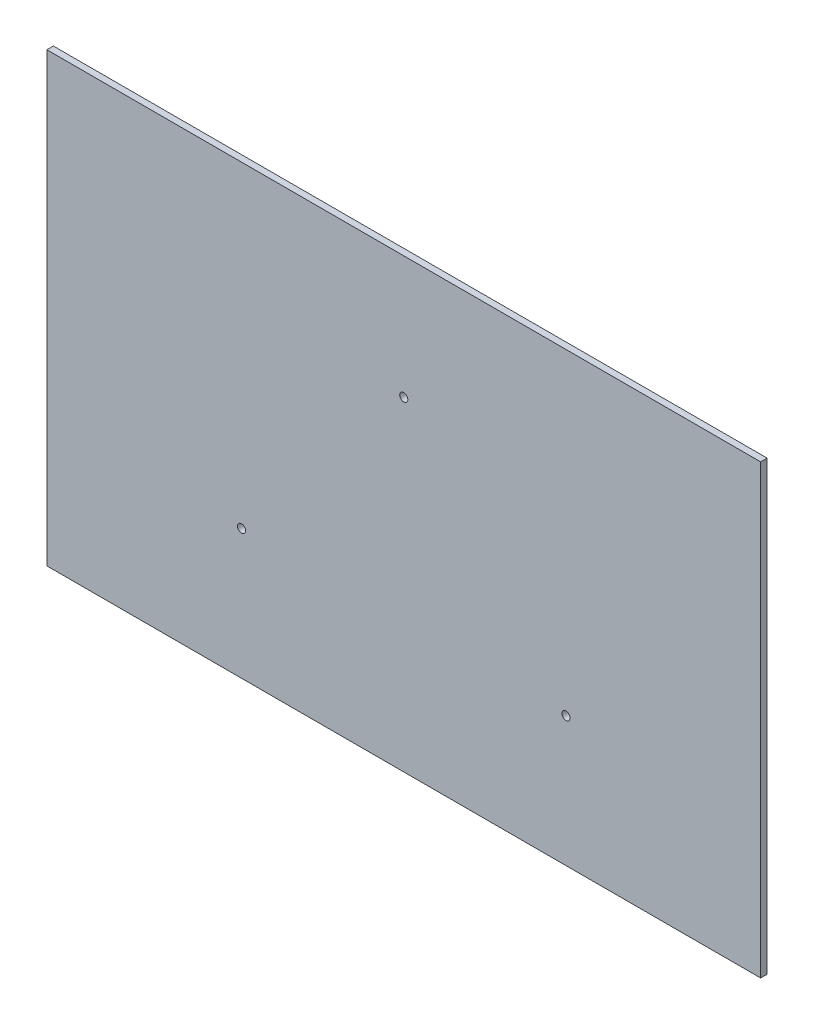
ISO-10303-21;
HEADER;
FILE_DESCRIPTION(('STEP AP214'),'2;1');
FILE_NAME('part.step','',(''),(''),'','','');
FILE_SCHEMA(('AUTOMOTIVE_DESIGN { 1 0 10303 214 1 1 1 1 }'));
ENDSEC;
DATA;
#1=APPLICATION_CONTEXT('core data for automotive mechanical design processes');
#2=APPLICATION_PROTOCOL_DEFINITION('international standard','automotive_design',2000,#1);
#3=PRODUCT_CONTEXT('',#1,'mechanical');
#4=PRODUCT('Part','Part','',(#3));
#5=PRODUCT_RELATED_PRODUCT_CATEGORY('part','',(#4));
#6=PRODUCT_DEFINITION_FORMATION('','',#4);
#7=PRODUCT_DEFINITION_CONTEXT('part definition',#1,'design');
#8=PRODUCT_DEFINITION('design','',#6,#7);
#9=PRODUCT_DEFINITION_SHAPE('','',#8);
#10=(LENGTH_UNIT() NAMED_UNIT(*) SI_UNIT(.MILLI.,.METRE.));
#11=(NAMED_UNIT(*) PLANE_ANGLE_UNIT() SI_UNIT($,.RADIAN.));
#12=(NAMED_UNIT(*) SI_UNIT($,.STERADIAN.) SOLID_ANGLE_UNIT());
#13=UNCERTAINTY_MEASURE_WITH_UNIT(LENGTH_MEASURE(1.E-05),#10,'distance_accuracy_value','');
#14=(GEOMETRIC_REPRESENTATION_CONTEXT(3) GLOBAL_UNCERTAINTY_ASSIGNED_CONTEXT((#13)) GLOBAL_UNIT_ASSIGNED_CONTEXT((#10,
#11,#12)) REPRESENTATION_CONTEXT('',''));
#15=CARTESIAN_POINT('',(0.,0.,0.));
#16=DIRECTION('',(0.,0.,1.));
#17=DIRECTION('',(1.,0.,0.));
#18=AXIS2_PLACEMENT_3D('',#15,#16,#17);
#19=CARTESIAN_POINT('',(0.,0.,2.54));
#20=DIRECTION('',(0.,0.,1.));
#21=DIRECTION('',(1.,0.,0.));
#22=AXIS2_PLACEMENT_3D('',#19,#20,#21);
#23=PLANE('',#22);
#24=CARTESIAN_POINT('',(63.5,-36.6888888888889,2.54));
#25=DIRECTION('',(0.,0.,1.));
#26=DIRECTION('',(1.,0.,0.));
#27=AXIS2_PLACEMENT_3D('',#24,#25,#26);
#28=CIRCLE('',#27,1.58749999999999);
#29=CARTESIAN_POINT('',(65.0875,-36.6888888888889,2.54));
#30=VERTEX_POINT('',#29);
#31=EDGE_CURVE('E118',#30,#30,#28,.T.);
#32=ORIENTED_EDGE('',*,*,#31,.F.);
#33=EDGE_LOOP('',(#32));
#34=FACE_BOUND('',#33,.T.);
#35=DIRECTION('',(0.,-1.,0.));
#36=VECTOR('',#35,1.);
#37=CARTESIAN_POINT('',(-139.7,-87.4888888888889,2.54));
#38=LINE('',#37,#36);
#39=CARTESIAN_POINT('',(-139.7,87.4888888888889,2.54));
#40=VERTEX_POINT('',#39);
#41=CARTESIAN_POINT('',(-139.7,-87.4888888888889,2.54));
#42=VERTEX_POINT('',#41);
#43=EDGE_CURVE('E88',#40,#42,#38,.T.);
#44=ORIENTED_EDGE('',*,*,#43,.T.);
#45=DIRECTION('',(1.,0.,0.));
#46=VECTOR('',#45,1.);
#47=CARTESIAN_POINT('',(139.7,-87.4888888888889,2.54));
#48=LINE('',#47,#46);
#49=CARTESIAN_POINT('',(139.7,-87.4888888888889,2.54));
#50=VERTEX_POINT('',#49);
#51=EDGE_CURVE('E83',#42,#50,#48,.T.);
#52=ORIENTED_EDGE('',*,*,#51,.T.);
#53=DIRECTION('',(0.,1.,0.));
#54=VECTOR('',#53,1.);
#55=CARTESIAN_POINT('',(139.7,-87.4888888888889,2.54));
#56=LINE('',#55,#54);
#57=CARTESIAN_POINT('',(139.7,87.4888888888889,2.54));
#58=VERTEX_POINT('',#57);
#59=EDGE_CURVE('E86',#50,#58,#56,.T.);
#60=ORIENTED_EDGE('',*,*,#59,.T.);
#61=DIRECTION('',(-1.,0.,0.));
#62=VECTOR('',#61,1.);
#63=CARTESIAN_POINT('',(139.7,87.4888888888889,2.54));
#64=LINE('',#63,#62);
#65=EDGE_CURVE('E53',#58,#40,#64,.T.);
#66=ORIENTED_EDGE('',*,*,#65,.T.);
#67=EDGE_LOOP('',(#44,#52,#60,#66));
#68=FACE_BOUND('',#67,.T.);
#69=CARTESIAN_POINT('',(-63.5,-36.6888888888889,2.54));
#70=DIRECTION('',(0.,0.,1.));
#71=DIRECTION('',(1.,0.,0.));
#72=AXIS2_PLACEMENT_3D('',#69,#70,#71);
#73=CIRCLE('',#72,1.58749999999999);
#74=CARTESIAN_POINT('',(-61.9125,-36.6888888888889,2.54));
#75=VERTEX_POINT('',#74);
#76=EDGE_CURVE('E103',#75,#75,#73,.T.);
#77=ORIENTED_EDGE('',*,*,#76,.F.);
#78=EDGE_LOOP('',(#77));
#79=FACE_BOUND('',#78,.T.);
#80=CARTESIAN_POINT('',(0.,39.5111111111111,2.54));
#81=DIRECTION('',(0.,0.,1.));
#82=DIRECTION('',(1.,0.,0.));
#83=AXIS2_PLACEMENT_3D('',#80,#81,#82);
#84=CIRCLE('',#83,1.5875);
#85=CARTESIAN_POINT('',(1.5875,39.5111111111111,2.54));
#86=VERTEX_POINT('',#85);
#87=EDGE_CURVE('E124',#86,#86,#84,.T.);
#88=ORIENTED_EDGE('',*,*,#87,.F.);
#89=EDGE_LOOP('',(#88));
#90=FACE_BOUND('',#89,.T.);
#91=ADVANCED_FACE('F36',(#34,#68,#79,#90),#23,.T.);
#92=CARTESIAN_POINT('',(0.,0.,0.));
#93=DIRECTION('',(0.,0.,1.));
#94=DIRECTION('',(1.,0.,0.));
#95=AXIS2_PLACEMENT_3D('',#92,#93,#94);
#96=PLANE('',#95);
#97=DIRECTION('',(0.,-1.,0.));
#98=VECTOR('',#97,1.);
#99=CARTESIAN_POINT('',(-139.7,-87.4888888888889,0.));
#100=LINE('',#99,#98);
#101=CARTESIAN_POINT('',(-139.7,87.4888888888889,0.));
#102=VERTEX_POINT('',#101);
#103=CARTESIAN_POINT('',(-139.7,-87.4888888888889,0.));
#104=VERTEX_POINT('',#103);
#105=EDGE_CURVE('E100',#102,#104,#100,.T.);
#106=ORIENTED_EDGE('',*,*,#105,.F.);
#107=DIRECTION('',(-1.,0.,0.));
#108=VECTOR('',#107,1.);
#109=CARTESIAN_POINT('',(139.7,87.4888888888889,0.));
#110=LINE('',#109,#108);
#111=CARTESIAN_POINT('',(139.7,87.4888888888889,0.));
#112=VERTEX_POINT('',#111);
#113=EDGE_CURVE('E76',#112,#102,#110,.T.);
#114=ORIENTED_EDGE('',*,*,#113,.F.);
#115=DIRECTION('',(0.,1.,0.));
#116=VECTOR('',#115,1.);
#117=CARTESIAN_POINT('',(139.7,-87.4888888888889,0.));
#118=LINE('',#117,#116);
#119=CARTESIAN_POINT('',(139.7,-87.4888888888889,0.));
#120=VERTEX_POINT('',#119);
#121=EDGE_CURVE('E70',#120,#112,#118,.T.);
#122=ORIENTED_EDGE('',*,*,#121,.F.);
#123=DIRECTION('',(1.,0.,0.));
#124=VECTOR('',#123,1.);
#125=CARTESIAN_POINT('',(139.7,-87.4888888888889,0.));
#126=LINE('',#125,#124);
#127=EDGE_CURVE('E92',#104,#120,#126,.T.);
#128=ORIENTED_EDGE('',*,*,#127,.F.);
#129=EDGE_LOOP('',(#106,#114,#122,#128));
#130=FACE_BOUND('',#129,.T.);
#131=CARTESIAN_POINT('',(-63.5,-36.6888888888889,0.));
#132=DIRECTION('',(0.,0.,1.));
#133=DIRECTION('',(1.,0.,0.));
#134=AXIS2_PLACEMENT_3D('',#131,#132,#133);
#135=CIRCLE('',#134,1.58749999999999);
#136=CARTESIAN_POINT('',(-61.9125,-36.6888888888889,0.));
#137=VERTEX_POINT('',#136);
#138=EDGE_CURVE('E115',#137,#137,#135,.T.);
#139=ORIENTED_EDGE('',*,*,#138,.T.);
#140=EDGE_LOOP('',(#139));
#141=FACE_BOUND('',#140,.T.);
#142=CARTESIAN_POINT('',(63.5,-36.6888888888889,0.));
#143=DIRECTION('',(0.,0.,1.));
#144=DIRECTION('',(1.,0.,0.));
#145=AXIS2_PLACEMENT_3D('',#142,#143,#144);
#146=CIRCLE('',#145,1.58749999999999);
#147=CARTESIAN_POINT('',(65.0875,-36.6888888888889,0.));
#148=VERTEX_POINT('',#147);
#149=EDGE_CURVE('E121',#148,#148,#146,.T.);
#150=ORIENTED_EDGE('',*,*,#149,.T.);
#151=EDGE_LOOP('',(#150));
#152=FACE_BOUND('',#151,.T.);
#153=CARTESIAN_POINT('',(0.,39.5111111111111,0.));
#154=DIRECTION('',(0.,0.,1.));
#155=DIRECTION('',(1.,0.,0.));
#156=AXIS2_PLACEMENT_3D('',#153,#154,#155);
#157=CIRCLE('',#156,1.5875);
#158=CARTESIAN_POINT('',(1.5875,39.5111111111111,0.));
#159=VERTEX_POINT('',#158);
#160=EDGE_CURVE('E127',#159,#159,#157,.T.);
#161=ORIENTED_EDGE('',*,*,#160,.T.);
#162=EDGE_LOOP('',(#161));
#163=FACE_BOUND('',#162,.T.);
#164=ADVANCED_FACE('F111',(#130,#141,#152,#163),#96,.F.);
#165=CARTESIAN_POINT('',(-139.7,-87.4888888888889,2.54));
#166=DIRECTION('',(1.,0.,0.));
#167=DIRECTION('',(0.,0.,-1.));
#168=AXIS2_PLACEMENT_3D('',#165,#166,#167);
#169=PLANE('',#168);
#170=ORIENTED_EDGE('',*,*,#105,.T.);
#171=DIRECTION('',(0.,0.,-1.));
#172=VECTOR('',#171,1.);
#173=CARTESIAN_POINT('',(-139.7,-87.4888888888889,2.54));
#174=LINE('',#173,#172);
#175=EDGE_CURVE('E11',#42,#104,#174,.T.);
#176=ORIENTED_EDGE('',*,*,#175,.F.);
#177=ORIENTED_EDGE('',*,*,#43,.F.);
#178=DIRECTION('',(0.,0.,-1.));
#179=VECTOR('',#178,1.);
#180=CARTESIAN_POINT('',(-139.7,87.4888888888889,2.54));
#181=LINE('',#180,#179);
#182=EDGE_CURVE('E96',#40,#102,#181,.T.);
#183=ORIENTED_EDGE('',*,*,#182,.T.);
#184=EDGE_LOOP('',(#170,#176,#177,#183));
#185=FACE_BOUND('',#184,.T.);
#186=ADVANCED_FACE('F38',(#185),#169,.F.);
#187=CARTESIAN_POINT('',(139.7,-87.4888888888889,2.54));
#188=DIRECTION('',(0.,1.,0.));
#189=DIRECTION('',(0.,0.,1.));
#190=AXIS2_PLACEMENT_3D('',#187,#188,#189);
#191=PLANE('',#190);
#192=ORIENTED_EDGE('',*,*,#127,.T.);
#193=DIRECTION('',(0.,0.,-1.));
#194=VECTOR('',#193,1.);
#195=CARTESIAN_POINT('',(139.7,-87.4888888888889,2.54));
#196=LINE('',#195,#194);
#197=EDGE_CURVE('E45',#50,#120,#196,.T.);
#198=ORIENTED_EDGE('',*,*,#197,.F.);
#199=ORIENTED_EDGE('',*,*,#51,.F.);
#200=ORIENTED_EDGE('',*,*,#175,.T.);
#201=EDGE_LOOP('',(#192,#198,#199,#200));
#202=FACE_BOUND('',#201,.T.);
#203=ADVANCED_FACE('F91',(#202),#191,.F.);
#204=CARTESIAN_POINT('',(139.7,-87.4888888888889,2.54));
#205=DIRECTION('',(-1.,0.,0.));
#206=DIRECTION('',(0.,0.,1.));
#207=AXIS2_PLACEMENT_3D('',#204,#205,#206);
#208=PLANE('',#207);
#209=ORIENTED_EDGE('',*,*,#121,.T.);
#210=DIRECTION('',(0.,0.,-1.));
#211=VECTOR('',#210,1.);
#212=CARTESIAN_POINT('',(139.7,87.4888888888889,2.54));
#213=LINE('',#212,#211);
#214=EDGE_CURVE('E93',#58,#112,#213,.T.);
#215=ORIENTED_EDGE('',*,*,#214,.F.);
#216=ORIENTED_EDGE('',*,*,#59,.F.);
#217=ORIENTED_EDGE('',*,*,#197,.T.);
#218=EDGE_LOOP('',(#209,#215,#216,#217));
#219=FACE_BOUND('',#218,.T.);
#220=ADVANCED_FACE('F94',(#219),#208,.F.);
#221=CARTESIAN_POINT('',(139.7,87.4888888888889,2.54));
#222=DIRECTION('',(0.,-1.,0.));
#223=DIRECTION('',(0.,0.,-1.));
#224=AXIS2_PLACEMENT_3D('',#221,#222,#223);
#225=PLANE('',#224);
#226=ORIENTED_EDGE('',*,*,#113,.T.);
#227=ORIENTED_EDGE('',*,*,#182,.F.);
#228=ORIENTED_EDGE('',*,*,#65,.F.);
#229=ORIENTED_EDGE('',*,*,#214,.T.);
#230=EDGE_LOOP('',(#226,#227,#228,#229));
#231=FACE_BOUND('',#230,.T.);
#232=ADVANCED_FACE('F108',(#231),#225,.F.);
#233=CARTESIAN_POINT('',(-63.5,-36.6888888888889,2.54));
#234=DIRECTION('',(0.,0.,-1.));
#235=DIRECTION('',(-1.,0.,0.));
#236=AXIS2_PLACEMENT_3D('',#233,#234,#235);
#237=CYLINDRICAL_SURFACE('',#236,1.58749999999999);
#238=ORIENTED_EDGE('',*,*,#76,.T.);
#239=EDGE_LOOP('',(#238));
#240=FACE_BOUND('',#239,.T.);
#241=ORIENTED_EDGE('',*,*,#138,.F.);
#242=EDGE_LOOP('',(#241));
#243=FACE_BOUND('',#242,.T.);
#244=ADVANCED_FACE('F145',(#240,#243),#237,.F.);
#245=CARTESIAN_POINT('',(63.5,-36.6888888888889,2.54));
#246=DIRECTION('',(0.,0.,-1.));
#247=DIRECTION('',(-1.,0.,0.));
#248=AXIS2_PLACEMENT_3D('',#245,#246,#247);
#249=CYLINDRICAL_SURFACE('',#248,1.58749999999999);
#250=ORIENTED_EDGE('',*,*,#31,.T.);
#251=EDGE_LOOP('',(#250));
#252=FACE_BOUND('',#251,.T.);
#253=ORIENTED_EDGE('',*,*,#149,.F.);
#254=EDGE_LOOP('',(#253));
#255=FACE_BOUND('',#254,.T.);
#256=ADVANCED_FACE('F191',(#252,#255),#249,.F.);
#257=CARTESIAN_POINT('',(0.,39.5111111111111,2.54));
#258=DIRECTION('',(0.,0.,-1.));
#259=DIRECTION('',(-1.,0.,0.));
#260=AXIS2_PLACEMENT_3D('',#257,#258,#259);
#261=CYLINDRICAL_SURFACE('',#260,1.5875);
#262=ORIENTED_EDGE('',*,*,#87,.T.);
#263=EDGE_LOOP('',(#262));
#264=FACE_BOUND('',#263,.T.);
#265=ORIENTED_EDGE('',*,*,#160,.F.);
#266=EDGE_LOOP('',(#265));
#267=FACE_BOUND('',#266,.T.);
#268=ADVANCED_FACE('F133',(#264,#267),#261,.F.);
#269=CLOSED_SHELL('',(#91,#164,#186,#203,#220,#232,#244,#256,#268));
#270=MANIFOLD_SOLID_BREP('B2',#269);
#271=ADVANCED_BREP_SHAPE_REPRESENTATION('',(#18,#270),#14);
#272=SHAPE_DEFINITION_REPRESENTATION(#9,#271);
ENDSEC;
END-ISO-10303-21;
